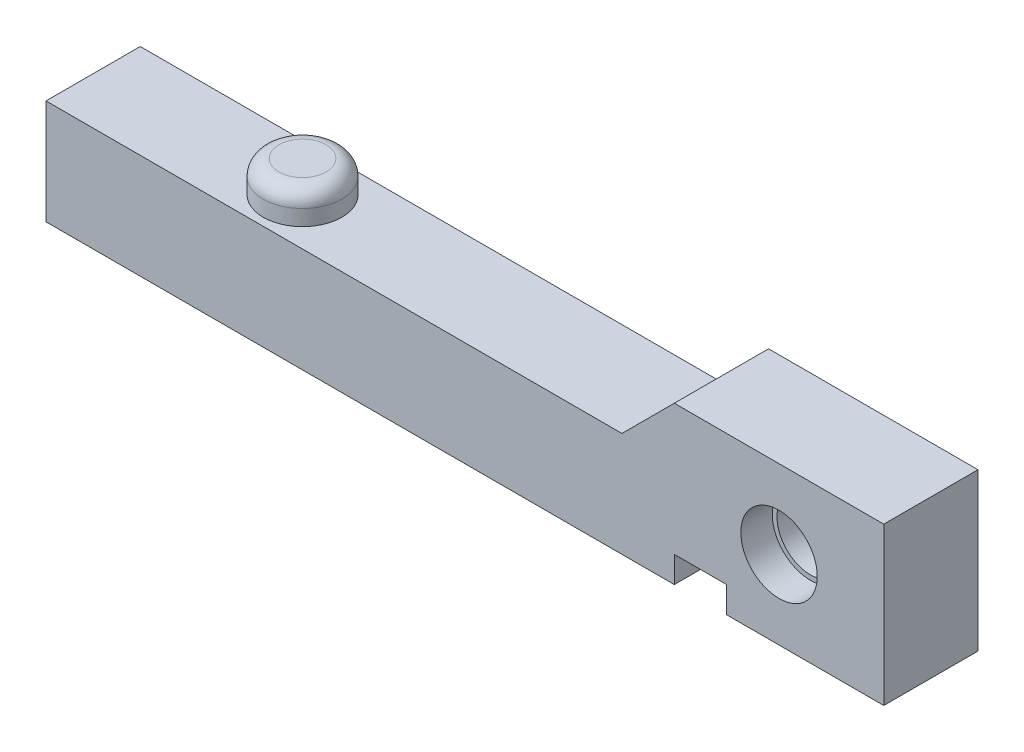
ISO-10303-21;
HEADER;
FILE_DESCRIPTION(('STEP AP214'),'2;1');
FILE_NAME('part.step','',(''),(''),'','','');
FILE_SCHEMA(('AUTOMOTIVE_DESIGN { 1 0 10303 214 1 1 1 1 }'));
ENDSEC;
DATA;
#1=APPLICATION_CONTEXT('core data for automotive mechanical design processes');
#2=APPLICATION_PROTOCOL_DEFINITION('international standard','automotive_design',2000,#1);
#3=PRODUCT_CONTEXT('',#1,'mechanical');
#4=PRODUCT('Part','Part','',(#3));
#5=PRODUCT_RELATED_PRODUCT_CATEGORY('part','',(#4));
#6=PRODUCT_DEFINITION_FORMATION('','',#4);
#7=PRODUCT_DEFINITION_CONTEXT('part definition',#1,'design');
#8=PRODUCT_DEFINITION('design','',#6,#7);
#9=PRODUCT_DEFINITION_SHAPE('','',#8);
#10=(LENGTH_UNIT() NAMED_UNIT(*) SI_UNIT(.MILLI.,.METRE.));
#11=(NAMED_UNIT(*) PLANE_ANGLE_UNIT() SI_UNIT($,.RADIAN.));
#12=(NAMED_UNIT(*) SI_UNIT($,.STERADIAN.) SOLID_ANGLE_UNIT());
#13=UNCERTAINTY_MEASURE_WITH_UNIT(LENGTH_MEASURE(1.E-05),#10,'distance_accuracy_value','');
#14=(GEOMETRIC_REPRESENTATION_CONTEXT(3) GLOBAL_UNCERTAINTY_ASSIGNED_CONTEXT((#13)) GLOBAL_UNIT_ASSIGNED_CONTEXT((#10,
#11,#12)) REPRESENTATION_CONTEXT('',''));
#15=CARTESIAN_POINT('',(0.,0.,0.));
#16=DIRECTION('',(0.,0.,1.));
#17=DIRECTION('',(1.,0.,0.));
#18=AXIS2_PLACEMENT_3D('',#15,#16,#17);
#19=CARTESIAN_POINT('',(70.,7.5,-4.5));
#20=DIRECTION('',(0.,0.,1.));
#21=DIRECTION('',(1.,0.,0.));
#22=AXIS2_PLACEMENT_3D('',#19,#20,#21);
#23=CYLINDRICAL_SURFACE('',#22,3.20000000000001);
#24=CARTESIAN_POINT('',(70.,7.5,1.5));
#25=DIRECTION('',(0.,0.,1.));
#26=DIRECTION('',(1.,0.,0.));
#27=AXIS2_PLACEMENT_3D('',#24,#25,#26);
#28=CIRCLE('',#27,3.20000000000001);
#29=CARTESIAN_POINT('',(73.2,7.5,1.5));
#30=VERTEX_POINT('',#29);
#31=EDGE_CURVE('E135',#30,#30,#28,.F.);
#32=ORIENTED_EDGE('',*,*,#31,.F.);
#33=EDGE_LOOP('',(#32));
#34=FACE_BOUND('',#33,.T.);
#35=CARTESIAN_POINT('',(70.,7.5,-1.5));
#36=DIRECTION('',(0.,0.,-1.));
#37=DIRECTION('',(-1.,0.,0.));
#38=AXIS2_PLACEMENT_3D('',#35,#36,#37);
#39=CIRCLE('',#38,3.20000000000001);
#40=CARTESIAN_POINT('',(66.8,7.5,-1.5));
#41=VERTEX_POINT('',#40);
#42=EDGE_CURVE('E202',#41,#41,#39,.F.);
#43=ORIENTED_EDGE('',*,*,#42,.F.);
#44=EDGE_LOOP('',(#43));
#45=FACE_BOUND('',#44,.T.);
#46=ADVANCED_FACE('F35',(#34,#45),#23,.F.);
#47=CARTESIAN_POINT('',(0.,0.,-4.5));
#48=DIRECTION('',(-1.,0.,0.));
#49=DIRECTION('',(0.,0.,1.));
#50=AXIS2_PLACEMENT_3D('',#47,#48,#49);
#51=PLANE('',#50);
#52=DIRECTION('',(0.,0.,1.));
#53=VECTOR('',#52,1.);
#54=CARTESIAN_POINT('',(0.,0.,-4.5));
#55=LINE('',#54,#53);
#56=CARTESIAN_POINT('',(0.,0.,-4.5));
#57=VERTEX_POINT('',#56);
#58=CARTESIAN_POINT('',(0.,0.,4.5));
#59=VERTEX_POINT('',#58);
#60=EDGE_CURVE('E111',#57,#59,#55,.T.);
#61=ORIENTED_EDGE('',*,*,#60,.T.);
#62=DIRECTION('',(0.,-1.,0.));
#63=VECTOR('',#62,1.);
#64=CARTESIAN_POINT('',(0.,0.,4.5));
#65=LINE('',#64,#63);
#66=CARTESIAN_POINT('',(0.,10.,4.5));
#67=VERTEX_POINT('',#66);
#68=EDGE_CURVE('E115',#67,#59,#65,.T.);
#69=ORIENTED_EDGE('',*,*,#68,.F.);
#70=DIRECTION('',(0.,0.,1.));
#71=VECTOR('',#70,1.);
#72=CARTESIAN_POINT('',(0.,10.,-4.5));
#73=LINE('',#72,#71);
#74=CARTESIAN_POINT('',(0.,10.,-4.5));
#75=VERTEX_POINT('',#74);
#76=EDGE_CURVE('E50',#75,#67,#73,.T.);
#77=ORIENTED_EDGE('',*,*,#76,.F.);
#78=DIRECTION('',(0.,-1.,0.));
#79=VECTOR('',#78,1.);
#80=CARTESIAN_POINT('',(0.,0.,-4.5));
#81=LINE('',#80,#79);
#82=EDGE_CURVE('E116',#75,#57,#81,.T.);
#83=ORIENTED_EDGE('',*,*,#82,.T.);
#84=EDGE_LOOP('',(#61,#69,#77,#83));
#85=FACE_BOUND('',#84,.T.);
#86=ADVANCED_FACE('F113',(#85),#51,.T.);
#87=CARTESIAN_POINT('',(0.,10.,-4.5));
#88=DIRECTION('',(0.,1.,0.));
#89=DIRECTION('',(0.,0.,1.));
#90=AXIS2_PLACEMENT_3D('',#87,#88,#89);
#91=PLANE('',#90);
#92=CARTESIAN_POINT('',(20.,10.,0.));
#93=DIRECTION('',(0.,1.,0.));
#94=DIRECTION('',(0.,0.,1.));
#95=AXIS2_PLACEMENT_3D('',#92,#93,#94);
#96=CIRCLE('',#95,3.75);
#97=CARTESIAN_POINT('',(20.,10.,3.75));
#98=VERTEX_POINT('',#97);
#99=EDGE_CURVE('E408',#98,#98,#96,.T.);
#100=ORIENTED_EDGE('',*,*,#99,.F.);
#101=EDGE_LOOP('',(#100));
#102=FACE_BOUND('',#101,.T.);
#103=ORIENTED_EDGE('',*,*,#76,.T.);
#104=DIRECTION('',(-1.,0.,0.));
#105=VECTOR('',#104,1.);
#106=CARTESIAN_POINT('',(0.,10.,4.5));
#107=LINE('',#106,#105);
#108=CARTESIAN_POINT('',(55.,10.,4.5));
#109=VERTEX_POINT('',#108);
#110=EDGE_CURVE('E134',#109,#67,#107,.T.);
#111=ORIENTED_EDGE('',*,*,#110,.F.);
#112=DIRECTION('',(0.,0.,1.));
#113=VECTOR('',#112,1.);
#114=CARTESIAN_POINT('',(55.,10.,-4.5));
#115=LINE('',#114,#113);
#116=CARTESIAN_POINT('',(55.,10.,-4.5));
#117=VERTEX_POINT('',#116);
#118=EDGE_CURVE('E58',#117,#109,#115,.T.);
#119=ORIENTED_EDGE('',*,*,#118,.F.);
#120=DIRECTION('',(-1.,0.,0.));
#121=VECTOR('',#120,1.);
#122=CARTESIAN_POINT('',(0.,10.,-4.5));
#123=LINE('',#122,#121);
#124=EDGE_CURVE('E120',#117,#75,#123,.T.);
#125=ORIENTED_EDGE('',*,*,#124,.T.);
#126=EDGE_LOOP('',(#103,#111,#119,#125));
#127=FACE_BOUND('',#126,.T.);
#128=ADVANCED_FACE('F224',(#102,#127),#91,.T.);
#129=CARTESIAN_POINT('',(55.,10.,-4.5));
#130=DIRECTION('',(-0.707106781186549,0.707106781186546,0.));
#131=DIRECTION('',(-0.707106781186546,-0.707106781186549,0.));
#132=AXIS2_PLACEMENT_3D('',#129,#130,#131);
#133=PLANE('',#132);
#134=ORIENTED_EDGE('',*,*,#118,.T.);
#135=DIRECTION('',(-0.707106781186546,-0.707106781186549,0.));
#136=VECTOR('',#135,1.);
#137=CARTESIAN_POINT('',(55.,10.,4.5));
#138=LINE('',#137,#136);
#139=CARTESIAN_POINT('',(60.,15.,4.5));
#140=VERTEX_POINT('',#139);
#141=EDGE_CURVE('E160',#140,#109,#138,.T.);
#142=ORIENTED_EDGE('',*,*,#141,.F.);
#143=DIRECTION('',(0.,0.,1.));
#144=VECTOR('',#143,1.);
#145=CARTESIAN_POINT('',(60.,15.,-4.5));
#146=LINE('',#145,#144);
#147=CARTESIAN_POINT('',(60.,15.,-4.5));
#148=VERTEX_POINT('',#147);
#149=EDGE_CURVE('E189',#148,#140,#146,.T.);
#150=ORIENTED_EDGE('',*,*,#149,.F.);
#151=DIRECTION('',(-0.707106781186546,-0.707106781186549,0.));
#152=VECTOR('',#151,1.);
#153=CARTESIAN_POINT('',(55.,10.,-4.5));
#154=LINE('',#153,#152);
#155=EDGE_CURVE('E184',#148,#117,#154,.T.);
#156=ORIENTED_EDGE('',*,*,#155,.T.);
#157=EDGE_LOOP('',(#134,#142,#150,#156));
#158=FACE_BOUND('',#157,.T.);
#159=ADVANCED_FACE('F236',(#158),#133,.T.);
#160=CARTESIAN_POINT('',(60.,15.,-4.5));
#161=DIRECTION('',(0.,1.,0.));
#162=DIRECTION('',(-1.,0.,0.));
#163=AXIS2_PLACEMENT_3D('',#160,#161,#162);
#164=PLANE('',#163);
#165=ORIENTED_EDGE('',*,*,#149,.T.);
#166=DIRECTION('',(-1.,0.,0.));
#167=VECTOR('',#166,1.);
#168=CARTESIAN_POINT('',(60.,15.,4.5));
#169=LINE('',#168,#167);
#170=CARTESIAN_POINT('',(80.,15.,4.5));
#171=VERTEX_POINT('',#170);
#172=EDGE_CURVE('E157',#171,#140,#169,.T.);
#173=ORIENTED_EDGE('',*,*,#172,.F.);
#174=DIRECTION('',(0.,0.,1.));
#175=VECTOR('',#174,1.);
#176=CARTESIAN_POINT('',(80.,15.,-4.5));
#177=LINE('',#176,#175);
#178=CARTESIAN_POINT('',(80.,15.,-4.5));
#179=VERTEX_POINT('',#178);
#180=EDGE_CURVE('E191',#179,#171,#177,.T.);
#181=ORIENTED_EDGE('',*,*,#180,.F.);
#182=DIRECTION('',(-1.,0.,0.));
#183=VECTOR('',#182,1.);
#184=CARTESIAN_POINT('',(60.,15.,-4.5));
#185=LINE('',#184,#183);
#186=EDGE_CURVE('E181',#179,#148,#185,.T.);
#187=ORIENTED_EDGE('',*,*,#186,.T.);
#188=EDGE_LOOP('',(#165,#173,#181,#187));
#189=FACE_BOUND('',#188,.T.);
#190=ADVANCED_FACE('F240',(#189),#164,.T.);
#191=CARTESIAN_POINT('',(80.,15.,-4.5));
#192=DIRECTION('',(1.,0.,0.));
#193=DIRECTION('',(0.,0.,-1.));
#194=AXIS2_PLACEMENT_3D('',#191,#192,#193);
#195=PLANE('',#194);
#196=ORIENTED_EDGE('',*,*,#180,.T.);
#197=DIRECTION('',(0.,1.,0.));
#198=VECTOR('',#197,1.);
#199=CARTESIAN_POINT('',(80.,15.,4.5));
#200=LINE('',#199,#198);
#201=CARTESIAN_POINT('',(80.,0.,4.5));
#202=VERTEX_POINT('',#201);
#203=EDGE_CURVE('E154',#202,#171,#200,.T.);
#204=ORIENTED_EDGE('',*,*,#203,.F.);
#205=DIRECTION('',(0.,0.,1.));
#206=VECTOR('',#205,1.);
#207=CARTESIAN_POINT('',(80.,0.,-4.5));
#208=LINE('',#207,#206);
#209=CARTESIAN_POINT('',(80.,0.,-4.5));
#210=VERTEX_POINT('',#209);
#211=EDGE_CURVE('E193',#210,#202,#208,.T.);
#212=ORIENTED_EDGE('',*,*,#211,.F.);
#213=DIRECTION('',(0.,1.,0.));
#214=VECTOR('',#213,1.);
#215=CARTESIAN_POINT('',(80.,15.,-4.5));
#216=LINE('',#215,#214);
#217=EDGE_CURVE('E178',#210,#179,#216,.T.);
#218=ORIENTED_EDGE('',*,*,#217,.T.);
#219=EDGE_LOOP('',(#196,#204,#212,#218));
#220=FACE_BOUND('',#219,.T.);
#221=ADVANCED_FACE('F244',(#220),#195,.T.);
#222=CARTESIAN_POINT('',(80.,0.,-4.5));
#223=DIRECTION('',(0.,-1.,0.));
#224=DIRECTION('',(1.,0.,0.));
#225=AXIS2_PLACEMENT_3D('',#222,#223,#224);
#226=PLANE('',#225);
#227=ORIENTED_EDGE('',*,*,#211,.T.);
#228=DIRECTION('',(1.,0.,0.));
#229=VECTOR('',#228,1.);
#230=CARTESIAN_POINT('',(80.,0.,4.5));
#231=LINE('',#230,#229);
#232=CARTESIAN_POINT('',(65.,0.,4.5));
#233=VERTEX_POINT('',#232);
#234=EDGE_CURVE('E151',#233,#202,#231,.T.);
#235=ORIENTED_EDGE('',*,*,#234,.F.);
#236=DIRECTION('',(0.,0.,1.));
#237=VECTOR('',#236,1.);
#238=CARTESIAN_POINT('',(65.,0.,-4.5));
#239=LINE('',#238,#237);
#240=CARTESIAN_POINT('',(65.,0.,-4.5));
#241=VERTEX_POINT('',#240);
#242=EDGE_CURVE('E195',#241,#233,#239,.T.);
#243=ORIENTED_EDGE('',*,*,#242,.F.);
#244=DIRECTION('',(1.,0.,0.));
#245=VECTOR('',#244,1.);
#246=CARTESIAN_POINT('',(80.,0.,-4.5));
#247=LINE('',#246,#245);
#248=EDGE_CURVE('E175',#241,#210,#247,.T.);
#249=ORIENTED_EDGE('',*,*,#248,.T.);
#250=EDGE_LOOP('',(#227,#235,#243,#249));
#251=FACE_BOUND('',#250,.T.);
#252=ADVANCED_FACE('F248',(#251),#226,.T.);
#253=CARTESIAN_POINT('',(65.,2.49999999999999,-4.5));
#254=DIRECTION('',(-1.,0.,0.));
#255=DIRECTION('',(0.,0.,1.));
#256=AXIS2_PLACEMENT_3D('',#253,#254,#255);
#257=PLANE('',#256);
#258=ORIENTED_EDGE('',*,*,#242,.T.);
#259=DIRECTION('',(0.,-1.,0.));
#260=VECTOR('',#259,1.);
#261=CARTESIAN_POINT('',(65.,2.49999999999999,4.5));
#262=LINE('',#261,#260);
#263=CARTESIAN_POINT('',(65.,2.49999999999999,4.5));
#264=VERTEX_POINT('',#263);
#265=EDGE_CURVE('E148',#264,#233,#262,.T.);
#266=ORIENTED_EDGE('',*,*,#265,.F.);
#267=DIRECTION('',(0.,0.,1.));
#268=VECTOR('',#267,1.);
#269=CARTESIAN_POINT('',(65.,2.49999999999999,-4.5));
#270=LINE('',#269,#268);
#271=CARTESIAN_POINT('',(65.,2.49999999999999,-4.5));
#272=VERTEX_POINT('',#271);
#273=EDGE_CURVE('E197',#272,#264,#270,.T.);
#274=ORIENTED_EDGE('',*,*,#273,.F.);
#275=DIRECTION('',(0.,-1.,0.));
#276=VECTOR('',#275,1.);
#277=CARTESIAN_POINT('',(65.,2.49999999999999,-4.5));
#278=LINE('',#277,#276);
#279=EDGE_CURVE('E172',#272,#241,#278,.T.);
#280=ORIENTED_EDGE('',*,*,#279,.T.);
#281=EDGE_LOOP('',(#258,#266,#274,#280));
#282=FACE_BOUND('',#281,.T.);
#283=ADVANCED_FACE('F252',(#282),#257,.T.);
#284=CARTESIAN_POINT('',(60.,2.49999999999999,-4.5));
#285=DIRECTION('',(0.,-1.,0.));
#286=DIRECTION('',(1.,0.,0.));
#287=AXIS2_PLACEMENT_3D('',#284,#285,#286);
#288=PLANE('',#287);
#289=ORIENTED_EDGE('',*,*,#273,.T.);
#290=DIRECTION('',(1.,0.,0.));
#291=VECTOR('',#290,1.);
#292=CARTESIAN_POINT('',(60.,2.49999999999999,4.5));
#293=LINE('',#292,#291);
#294=CARTESIAN_POINT('',(60.,2.49999999999999,4.5));
#295=VERTEX_POINT('',#294);
#296=EDGE_CURVE('E145',#295,#264,#293,.T.);
#297=ORIENTED_EDGE('',*,*,#296,.F.);
#298=DIRECTION('',(0.,0.,1.));
#299=VECTOR('',#298,1.);
#300=CARTESIAN_POINT('',(60.,2.49999999999999,-4.5));
#301=LINE('',#300,#299);
#302=CARTESIAN_POINT('',(60.,2.49999999999999,-4.5));
#303=VERTEX_POINT('',#302);
#304=EDGE_CURVE('E199',#303,#295,#301,.T.);
#305=ORIENTED_EDGE('',*,*,#304,.F.);
#306=DIRECTION('',(1.,0.,0.));
#307=VECTOR('',#306,1.);
#308=CARTESIAN_POINT('',(60.,2.49999999999999,-4.5));
#309=LINE('',#308,#307);
#310=EDGE_CURVE('E169',#303,#272,#309,.T.);
#311=ORIENTED_EDGE('',*,*,#310,.T.);
#312=EDGE_LOOP('',(#289,#297,#305,#311));
#313=FACE_BOUND('',#312,.T.);
#314=ADVANCED_FACE('F256',(#313),#288,.T.);
#315=CARTESIAN_POINT('',(60.,0.,-4.5));
#316=DIRECTION('',(1.,0.,0.));
#317=DIRECTION('',(0.,0.,-1.));
#318=AXIS2_PLACEMENT_3D('',#315,#316,#317);
#319=PLANE('',#318);
#320=ORIENTED_EDGE('',*,*,#304,.T.);
#321=DIRECTION('',(0.,1.,0.));
#322=VECTOR('',#321,1.);
#323=CARTESIAN_POINT('',(60.,0.,4.5));
#324=LINE('',#323,#322);
#325=CARTESIAN_POINT('',(60.,0.,4.5));
#326=VERTEX_POINT('',#325);
#327=EDGE_CURVE('E129',#326,#295,#324,.T.);
#328=ORIENTED_EDGE('',*,*,#327,.F.);
#329=DIRECTION('',(0.,0.,1.));
#330=VECTOR('',#329,1.);
#331=CARTESIAN_POINT('',(60.,0.,-4.5));
#332=LINE('',#331,#330);
#333=CARTESIAN_POINT('',(60.,0.,-4.5));
#334=VERTEX_POINT('',#333);
#335=EDGE_CURVE('E119',#334,#326,#332,.T.);
#336=ORIENTED_EDGE('',*,*,#335,.F.);
#337=DIRECTION('',(0.,1.,0.));
#338=VECTOR('',#337,1.);
#339=CARTESIAN_POINT('',(60.,0.,-4.5));
#340=LINE('',#339,#338);
#341=EDGE_CURVE('E166',#334,#303,#340,.T.);
#342=ORIENTED_EDGE('',*,*,#341,.T.);
#343=EDGE_LOOP('',(#320,#328,#336,#342));
#344=FACE_BOUND('',#343,.T.);
#345=ADVANCED_FACE('F260',(#344),#319,.T.);
#346=CARTESIAN_POINT('',(60.,0.,-4.5));
#347=DIRECTION('',(0.,-1.,0.));
#348=DIRECTION('',(1.,0.,0.));
#349=AXIS2_PLACEMENT_3D('',#346,#347,#348);
#350=PLANE('',#349);
#351=ORIENTED_EDGE('',*,*,#335,.T.);
#352=DIRECTION('',(1.,0.,0.));
#353=VECTOR('',#352,1.);
#354=CARTESIAN_POINT('',(13.,0.,4.5));
#355=LINE('',#354,#353);
#356=EDGE_CURVE('E123',#59,#326,#355,.T.);
#357=ORIENTED_EDGE('',*,*,#356,.F.);
#358=ORIENTED_EDGE('',*,*,#60,.F.);
#359=DIRECTION('',(1.,0.,0.));
#360=VECTOR('',#359,1.);
#361=CARTESIAN_POINT('',(13.,0.,-4.5));
#362=LINE('',#361,#360);
#363=EDGE_CURVE('E164',#57,#334,#362,.T.);
#364=ORIENTED_EDGE('',*,*,#363,.T.);
#365=EDGE_LOOP('',(#351,#357,#358,#364));
#366=FACE_BOUND('',#365,.T.);
#367=ADVANCED_FACE('F124',(#366),#350,.T.);
#368=CARTESIAN_POINT('',(0.,0.,-4.5));
#369=DIRECTION('',(0.,0.,-1.));
#370=DIRECTION('',(-1.,0.,0.));
#371=AXIS2_PLACEMENT_3D('',#368,#369,#370);
#372=PLANE('',#371);
#373=CARTESIAN_POINT('',(70.,7.5,-4.5));
#374=DIRECTION('',(0.,0.,1.));
#375=DIRECTION('',(1.,0.,0.));
#376=AXIS2_PLACEMENT_3D('',#373,#374,#375);
#377=CIRCLE('',#376,3.65);
#378=CARTESIAN_POINT('',(73.65,7.5,-4.5));
#379=VERTEX_POINT('',#378);
#380=EDGE_CURVE('E409',#379,#379,#377,.T.);
#381=ORIENTED_EDGE('',*,*,#380,.T.);
#382=EDGE_LOOP('',(#381));
#383=FACE_BOUND('',#382,.T.);
#384=ORIENTED_EDGE('',*,*,#82,.F.);
#385=ORIENTED_EDGE('',*,*,#124,.F.);
#386=ORIENTED_EDGE('',*,*,#155,.F.);
#387=ORIENTED_EDGE('',*,*,#186,.F.);
#388=ORIENTED_EDGE('',*,*,#217,.F.);
#389=ORIENTED_EDGE('',*,*,#248,.F.);
#390=ORIENTED_EDGE('',*,*,#279,.F.);
#391=ORIENTED_EDGE('',*,*,#310,.F.);
#392=ORIENTED_EDGE('',*,*,#341,.F.);
#393=ORIENTED_EDGE('',*,*,#363,.F.);
#394=EDGE_LOOP('',(#384,#385,#386,#387,#388,#389,#390,#391,#392,#393));
#395=FACE_BOUND('',#394,.T.);
#396=ADVANCED_FACE('F230',(#383,#395),#372,.T.);
#397=CARTESIAN_POINT('',(0.,0.,4.5));
#398=DIRECTION('',(0.,0.,-1.));
#399=DIRECTION('',(-1.,0.,0.));
#400=AXIS2_PLACEMENT_3D('',#397,#398,#399);
#401=PLANE('',#400);
#402=CARTESIAN_POINT('',(70.,7.5,4.5));
#403=DIRECTION('',(0.,0.,1.));
#404=DIRECTION('',(1.,0.,0.));
#405=AXIS2_PLACEMENT_3D('',#402,#403,#404);
#406=CIRCLE('',#405,3.65);
#407=CARTESIAN_POINT('',(73.65,7.5,4.5));
#408=VERTEX_POINT('',#407);
#409=EDGE_CURVE('E141',#408,#408,#406,.T.);
#410=ORIENTED_EDGE('',*,*,#409,.F.);
#411=EDGE_LOOP('',(#410));
#412=FACE_BOUND('',#411,.T.);
#413=ORIENTED_EDGE('',*,*,#68,.T.);
#414=ORIENTED_EDGE('',*,*,#356,.T.);
#415=ORIENTED_EDGE('',*,*,#327,.T.);
#416=ORIENTED_EDGE('',*,*,#296,.T.);
#417=ORIENTED_EDGE('',*,*,#265,.T.);
#418=ORIENTED_EDGE('',*,*,#234,.T.);
#419=ORIENTED_EDGE('',*,*,#203,.T.);
#420=ORIENTED_EDGE('',*,*,#172,.T.);
#421=ORIENTED_EDGE('',*,*,#141,.T.);
#422=ORIENTED_EDGE('',*,*,#110,.T.);
#423=EDGE_LOOP('',(#413,#414,#415,#416,#417,#418,#419,#420,#421,#422));
#424=FACE_BOUND('',#423,.T.);
#425=ADVANCED_FACE('F132',(#412,#424),#401,.F.);
#426=CARTESIAN_POINT('',(70.,7.5,1.5));
#427=DIRECTION('',(0.,0.,1.));
#428=DIRECTION('',(1.,0.,0.));
#429=AXIS2_PLACEMENT_3D('',#426,#427,#428);
#430=PLANE('',#429);
#431=CARTESIAN_POINT('',(70.,7.5,1.5));
#432=DIRECTION('',(0.,0.,1.));
#433=DIRECTION('',(1.,0.,0.));
#434=AXIS2_PLACEMENT_3D('',#431,#432,#433);
#435=CIRCLE('',#434,3.65);
#436=CARTESIAN_POINT('',(73.65,7.5,1.5));
#437=VERTEX_POINT('',#436);
#438=EDGE_CURVE('E138',#437,#437,#435,.T.);
#439=ORIENTED_EDGE('',*,*,#438,.T.);
#440=EDGE_LOOP('',(#439));
#441=FACE_BOUND('',#440,.T.);
#442=ORIENTED_EDGE('',*,*,#31,.T.);
#443=EDGE_LOOP('',(#442));
#444=FACE_BOUND('',#443,.T.);
#445=ADVANCED_FACE('F281',(#441,#444),#430,.T.);
#446=CARTESIAN_POINT('',(70.,7.5,1.5));
#447=DIRECTION('',(0.,0.,1.));
#448=DIRECTION('',(1.,0.,0.));
#449=AXIS2_PLACEMENT_3D('',#446,#447,#448);
#450=CYLINDRICAL_SURFACE('',#449,3.65);
#451=ORIENTED_EDGE('',*,*,#438,.F.);
#452=EDGE_LOOP('',(#451));
#453=FACE_BOUND('',#452,.T.);
#454=ORIENTED_EDGE('',*,*,#409,.T.);
#455=EDGE_LOOP('',(#454));
#456=FACE_BOUND('',#455,.T.);
#457=ADVANCED_FACE('F288',(#453,#456),#450,.F.);
#458=CARTESIAN_POINT('',(70.,7.5,-1.5));
#459=DIRECTION('',(0.,0.,-1.));
#460=DIRECTION('',(1.,0.,0.));
#461=AXIS2_PLACEMENT_3D('',#458,#459,#460);
#462=PLANE('',#461);
#463=CARTESIAN_POINT('',(70.,7.5,-1.5));
#464=DIRECTION('',(0.,0.,1.));
#465=DIRECTION('',(1.,0.,0.));
#466=AXIS2_PLACEMENT_3D('',#463,#464,#465);
#467=CIRCLE('',#466,3.65);
#468=CARTESIAN_POINT('',(73.65,7.5,-1.5));
#469=VERTEX_POINT('',#468);
#470=EDGE_CURVE('E204',#469,#469,#467,.T.);
#471=ORIENTED_EDGE('',*,*,#470,.F.);
#472=EDGE_LOOP('',(#471));
#473=FACE_BOUND('',#472,.T.);
#474=ORIENTED_EDGE('',*,*,#42,.T.);
#475=EDGE_LOOP('',(#474));
#476=FACE_BOUND('',#475,.T.);
#477=ADVANCED_FACE('F296',(#473,#476),#462,.T.);
#478=CARTESIAN_POINT('',(70.,7.5,-1.5));
#479=DIRECTION('',(0.,0.,-1.));
#480=DIRECTION('',(-1.,0.,0.));
#481=AXIS2_PLACEMENT_3D('',#478,#479,#480);
#482=CYLINDRICAL_SURFACE('',#481,3.65);
#483=ORIENTED_EDGE('',*,*,#470,.T.);
#484=EDGE_LOOP('',(#483));
#485=FACE_BOUND('',#484,.T.);
#486=ORIENTED_EDGE('',*,*,#380,.F.);
#487=EDGE_LOOP('',(#486));
#488=FACE_BOUND('',#487,.T.);
#489=ADVANCED_FACE('F302',(#485,#488),#482,.F.);
#490=CARTESIAN_POINT('',(20.,13.,0.));
#491=DIRECTION('',(0.,-1.,0.));
#492=DIRECTION('',(0.,0.,-1.));
#493=AXIS2_PLACEMENT_3D('',#490,#491,#492);
#494=CYLINDRICAL_SURFACE('',#493,3.75);
#495=CARTESIAN_POINT('',(20.,11.5,0.));
#496=DIRECTION('',(0.,1.,0.));
#497=DIRECTION('',(0.,0.,1.));
#498=AXIS2_PLACEMENT_3D('',#495,#496,#497);
#499=CIRCLE('',#498,3.75);
#500=CARTESIAN_POINT('',(20.,11.5,3.75));
#501=VERTEX_POINT('',#500);
#502=EDGE_CURVE('E11',#501,#501,#499,.F.);
#503=ORIENTED_EDGE('',*,*,#502,.T.);
#504=EDGE_LOOP('',(#503));
#505=FACE_BOUND('',#504,.T.);
#506=ORIENTED_EDGE('',*,*,#99,.T.);
#507=EDGE_LOOP('',(#506));
#508=FACE_BOUND('',#507,.T.);
#509=ADVANCED_FACE('F215',(#505,#508),#494,.T.);
#510=CARTESIAN_POINT('',(20.,13.,0.));
#511=DIRECTION('',(0.,1.,0.));
#512=DIRECTION('',(0.,0.,1.));
#513=AXIS2_PLACEMENT_3D('',#510,#511,#512);
#514=PLANE('',#513);
#515=CARTESIAN_POINT('',(20.,13.,0.));
#516=DIRECTION('',(0.,1.,0.));
#517=DIRECTION('',(0.,0.,1.));
#518=AXIS2_PLACEMENT_3D('',#515,#516,#517);
#519=CIRCLE('',#518,2.25);
#520=CARTESIAN_POINT('',(20.,13.,2.25));
#521=VERTEX_POINT('',#520);
#522=EDGE_CURVE('E43',#521,#521,#519,.T.);
#523=ORIENTED_EDGE('',*,*,#522,.T.);
#524=EDGE_LOOP('',(#523));
#525=FACE_BOUND('',#524,.T.);
#526=ADVANCED_FACE('F208',(#525),#514,.T.);
#527=CARTESIAN_POINT('',(20.,11.5,0.));
#528=DIRECTION('',(0.,1.,0.));
#529=DIRECTION('',(0.,0.,1.));
#530=AXIS2_PLACEMENT_3D('',#527,#528,#529);
#531=TOROIDAL_SURFACE('',#530,2.25,1.5);
#532=ORIENTED_EDGE('',*,*,#502,.F.);
#533=EDGE_LOOP('',(#532));
#534=FACE_BOUND('',#533,.T.);
#535=ORIENTED_EDGE('',*,*,#522,.F.);
#536=EDGE_LOOP('',(#535));
#537=FACE_BOUND('',#536,.T.);
#538=ADVANCED_FACE('F37',(#534,#537),#531,.T.);
#539=CLOSED_SHELL('',(#46,#86,#128,#159,#190,#221,#252,#283,#314,#345,#367,#396,#425,#445,#457,
#477,#489,#509,#526,#538));
#540=MANIFOLD_SOLID_BREP('B2',#539);
#541=ADVANCED_BREP_SHAPE_REPRESENTATION('',(#18,#540),#14);
#542=SHAPE_DEFINITION_REPRESENTATION(#9,#541);
ENDSEC;
END-ISO-10303-21;
